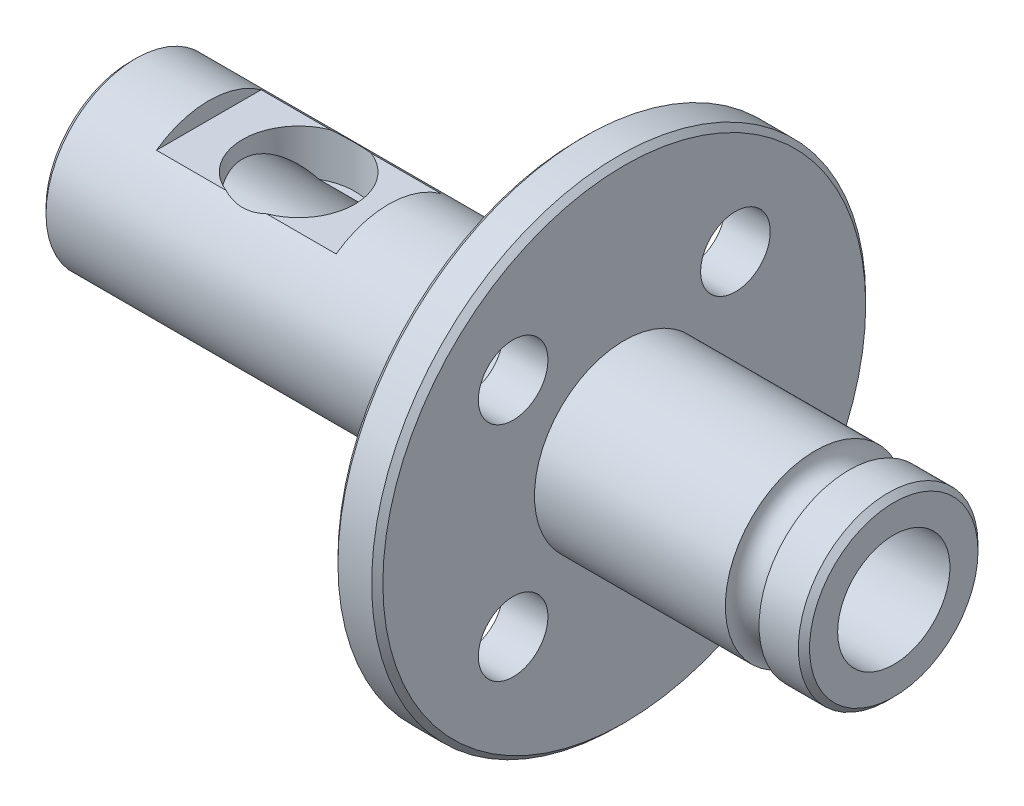
ISO-10303-21;
HEADER;
FILE_DESCRIPTION(('STEP AP214'),'2;1');
FILE_NAME('part.step','',(''),(''),'','','');
FILE_SCHEMA(('AUTOMOTIVE_DESIGN { 1 0 10303 214 1 1 1 1 }'));
ENDSEC;
DATA;
#1=APPLICATION_CONTEXT('core data for automotive mechanical design processes');
#2=APPLICATION_PROTOCOL_DEFINITION('international standard','automotive_design',2000,#1);
#3=PRODUCT_CONTEXT('',#1,'mechanical');
#4=PRODUCT('Part','Part','',(#3));
#5=PRODUCT_RELATED_PRODUCT_CATEGORY('part','',(#4));
#6=PRODUCT_DEFINITION_FORMATION('','',#4);
#7=PRODUCT_DEFINITION_CONTEXT('part definition',#1,'design');
#8=PRODUCT_DEFINITION('design','',#6,#7);
#9=PRODUCT_DEFINITION_SHAPE('','',#8);
#10=(LENGTH_UNIT() NAMED_UNIT(*) SI_UNIT(.MILLI.,.METRE.));
#11=(NAMED_UNIT(*) PLANE_ANGLE_UNIT() SI_UNIT($,.RADIAN.));
#12=(NAMED_UNIT(*) SI_UNIT($,.STERADIAN.) SOLID_ANGLE_UNIT());
#13=UNCERTAINTY_MEASURE_WITH_UNIT(LENGTH_MEASURE(1.E-05),#10,'distance_accuracy_value','');
#14=(GEOMETRIC_REPRESENTATION_CONTEXT(3) GLOBAL_UNCERTAINTY_ASSIGNED_CONTEXT((#13)) GLOBAL_UNIT_ASSIGNED_CONTEXT((#10,
#11,#12)) REPRESENTATION_CONTEXT('',''));
#15=CARTESIAN_POINT('',(0.,0.,0.));
#16=DIRECTION('',(0.,0.,1.));
#17=DIRECTION('',(1.,0.,0.));
#18=AXIS2_PLACEMENT_3D('',#15,#16,#17);
#19=CARTESIAN_POINT('',(34.,0.,0.));
#20=DIRECTION('',(-1.,0.,0.));
#21=DIRECTION('',(0.,0.,1.));
#22=AXIS2_PLACEMENT_3D('',#19,#20,#21);
#23=CYLINDRICAL_SURFACE('',#22,2.5);
#24=CARTESIAN_POINT('',(0.,0.,0.));
#25=DIRECTION('',(-1.,0.,0.));
#26=DIRECTION('',(0.,0.,1.));
#27=AXIS2_PLACEMENT_3D('',#24,#25,#26);
#28=CIRCLE('',#27,2.5);
#29=CARTESIAN_POINT('',(0.,0.,2.5));
#30=VERTEX_POINT('',#29);
#31=EDGE_CURVE('E175',#30,#30,#28,.T.);
#32=ORIENTED_EDGE('',*,*,#31,.T.);
#33=EDGE_LOOP('',(#32));
#34=FACE_BOUND('',#33,.T.);
#35=CARTESIAN_POINT('',(34.,0.,0.));
#36=DIRECTION('',(-1.,0.,0.));
#37=DIRECTION('',(0.,0.,1.));
#38=AXIS2_PLACEMENT_3D('',#35,#36,#37);
#39=CIRCLE('',#38,2.5);
#40=CARTESIAN_POINT('',(34.,0.,2.5));
#41=VERTEX_POINT('',#40);
#42=EDGE_CURVE('E176',#41,#41,#39,.T.);
#43=ORIENTED_EDGE('',*,*,#42,.F.);
#44=EDGE_LOOP('',(#43));
#45=FACE_BOUND('',#44,.T.);
#46=DIRECTION('',(-1.,0.,0.));
#47=VECTOR('',#46,1.);
#48=CARTESIAN_POINT('',(34.,1.25,-2.1650635094611));
#49=LINE('',#48,#47);
#50=CARTESIAN_POINT('',(6.25,1.25,-2.1650635094611));
#51=VERTEX_POINT('',#50);
#52=CARTESIAN_POINT('',(8.75,1.25,-2.1650635094611));
#53=VERTEX_POINT('',#52);
#54=EDGE_CURVE('E88',#51,#53,#49,.F.);
#55=ORIENTED_EDGE('',*,*,#54,.F.);
#56=CARTESIAN_POINT('',(7.5,0.,0.));
#57=DIRECTION('',(-0.707106781186547,-0.707106781186547,0.));
#58=DIRECTION('',(-0.707106781186547,0.707106781186547,0.));
#59=AXIS2_PLACEMENT_3D('',#56,#57,#58);
#60=ELLIPSE('',#59,3.53553390593274,2.5);
#61=CARTESIAN_POINT('',(6.25,1.25,2.1650635094611));
#62=VERTEX_POINT('',#61);
#63=EDGE_CURVE('E102',#51,#62,#60,.F.);
#64=ORIENTED_EDGE('',*,*,#63,.T.);
#65=DIRECTION('',(-1.,0.,0.));
#66=VECTOR('',#65,1.);
#67=CARTESIAN_POINT('',(34.,1.25,2.1650635094611));
#68=LINE('',#67,#66);
#69=CARTESIAN_POINT('',(8.75,1.25,2.1650635094611));
#70=VERTEX_POINT('',#69);
#71=EDGE_CURVE('E96',#70,#62,#68,.T.);
#72=ORIENTED_EDGE('',*,*,#71,.F.);
#73=CARTESIAN_POINT('',(7.5,0.,0.));
#74=DIRECTION('',(-0.707106781186547,0.707106781186547,0.));
#75=DIRECTION('',(-0.707106781186547,-0.707106781186547,0.));
#76=AXIS2_PLACEMENT_3D('',#73,#74,#75);
#77=ELLIPSE('',#76,3.53553390593274,2.5);
#78=EDGE_CURVE('E100',#70,#53,#77,.T.);
#79=ORIENTED_EDGE('',*,*,#78,.T.);
#80=EDGE_LOOP('',(#55,#64,#72,#79));
#81=FACE_BOUND('',#80,.T.);
#82=ADVANCED_FACE('F34',(#34,#45,#81),#23,.F.);
#83=CARTESIAN_POINT('',(0.,3.25,0.));
#84=DIRECTION('',(0.,-1.,0.));
#85=DIRECTION('',(0.,0.,-1.));
#86=AXIS2_PLACEMENT_3D('',#83,#84,#85);
#87=PLANE('',#86);
#88=DIRECTION('',(1.,0.,0.));
#89=VECTOR('',#88,1.);
#90=CARTESIAN_POINT('',(34.,3.25,-2.3318447632722));
#91=LINE('',#90,#89);
#92=CARTESIAN_POINT('',(11.5,3.25,-2.3318447632722));
#93=VERTEX_POINT('',#92);
#94=CARTESIAN_POINT('',(8.401387818866,3.25,-2.3318447632722));
#95=VERTEX_POINT('',#94);
#96=EDGE_CURVE('E230',#93,#95,#91,.F.);
#97=ORIENTED_EDGE('',*,*,#96,.T.);
#98=CARTESIAN_POINT('',(7.5,3.25,0.));
#99=DIRECTION('',(0.,1.,0.));
#100=DIRECTION('',(0.,0.,1.));
#101=AXIS2_PLACEMENT_3D('',#98,#99,#100);
#102=CIRCLE('',#101,2.5);
#103=CARTESIAN_POINT('',(8.401387818866,3.25,2.3318447632722));
#104=VERTEX_POINT('',#103);
#105=EDGE_CURVE('E461',#104,#95,#102,.T.);
#106=ORIENTED_EDGE('',*,*,#105,.F.);
#107=DIRECTION('',(1.,0.,0.));
#108=VECTOR('',#107,1.);
#109=CARTESIAN_POINT('',(34.,3.25,2.3318447632722));
#110=LINE('',#109,#108);
#111=CARTESIAN_POINT('',(11.5,3.25,2.3318447632722));
#112=VERTEX_POINT('',#111);
#113=EDGE_CURVE('E225',#104,#112,#110,.T.);
#114=ORIENTED_EDGE('',*,*,#113,.T.);
#115=DIRECTION('',(0.,0.,-1.));
#116=VECTOR('',#115,1.);
#117=CARTESIAN_POINT('',(11.5,3.25,2.5));
#118=LINE('',#117,#116);
#119=EDGE_CURVE('E182',#112,#93,#118,.T.);
#120=ORIENTED_EDGE('',*,*,#119,.T.);
#121=EDGE_LOOP('',(#97,#106,#114,#120));
#122=FACE_BOUND('',#121,.T.);
#123=ADVANCED_FACE('F137',(#122),#87,.F.);
#124=CARTESIAN_POINT('',(34.,4.,0.));
#125=DIRECTION('',(1.,0.,0.));
#126=DIRECTION('',(0.,0.,-1.));
#127=AXIS2_PLACEMENT_3D('',#124,#125,#126);
#128=PLANE('',#127);
#129=CARTESIAN_POINT('',(34.,0.,0.));
#130=DIRECTION('',(1.,0.,0.));
#131=DIRECTION('',(0.,0.,-1.));
#132=AXIS2_PLACEMENT_3D('',#129,#130,#131);
#133=CIRCLE('',#132,3.75000000000001);
#134=CARTESIAN_POINT('',(34.,0.,-3.75000000000001));
#135=VERTEX_POINT('',#134);
#136=EDGE_CURVE('E95',#135,#135,#133,.T.);
#137=ORIENTED_EDGE('',*,*,#136,.T.);
#138=EDGE_LOOP('',(#137));
#139=FACE_BOUND('',#138,.T.);
#140=ORIENTED_EDGE('',*,*,#42,.T.);
#141=EDGE_LOOP('',(#140));
#142=FACE_BOUND('',#141,.T.);
#143=ADVANCED_FACE('F284',(#139,#142),#128,.T.);
#144=CARTESIAN_POINT('',(34.,0.,0.));
#145=DIRECTION('',(1.,0.,0.));
#146=DIRECTION('',(0.,0.,-1.));
#147=AXIS2_PLACEMENT_3D('',#144,#145,#146);
#148=CYLINDRICAL_SURFACE('',#147,4.);
#149=CARTESIAN_POINT('',(33.75,0.,0.));
#150=DIRECTION('',(1.,0.,0.));
#151=DIRECTION('',(0.,0.,-1.));
#152=AXIS2_PLACEMENT_3D('',#149,#150,#151);
#153=CIRCLE('',#152,4.);
#154=CARTESIAN_POINT('',(33.75,0.,-4.));
#155=VERTEX_POINT('',#154);
#156=EDGE_CURVE('E238',#155,#155,#153,.F.);
#157=ORIENTED_EDGE('',*,*,#156,.T.);
#158=EDGE_LOOP('',(#157));
#159=FACE_BOUND('',#158,.T.);
#160=CARTESIAN_POINT('',(32.,0.,0.));
#161=DIRECTION('',(1.,0.,0.));
#162=DIRECTION('',(0.,0.,-1.));
#163=AXIS2_PLACEMENT_3D('',#160,#161,#162);
#164=CIRCLE('',#163,4.);
#165=CARTESIAN_POINT('',(32.,0.,-4.));
#166=VERTEX_POINT('',#165);
#167=EDGE_CURVE('E217',#166,#166,#164,.T.);
#168=ORIENTED_EDGE('',*,*,#167,.T.);
#169=EDGE_LOOP('',(#168));
#170=FACE_BOUND('',#169,.T.);
#171=ADVANCED_FACE('F287',(#159,#170),#148,.T.);
#172=CARTESIAN_POINT('',(31.25,0.,0.));
#173=DIRECTION('',(1.,0.,0.));
#174=DIRECTION('',(0.,0.,-1.));
#175=AXIS2_PLACEMENT_3D('',#172,#173,#174);
#176=TOROIDAL_SURFACE('',#175,4.,0.749999999999992);
#177=CARTESIAN_POINT('',(30.5,0.,0.));
#178=DIRECTION('',(1.,0.,0.));
#179=DIRECTION('',(0.,0.,-1.));
#180=AXIS2_PLACEMENT_3D('',#177,#178,#179);
#181=CIRCLE('',#180,4.);
#182=CARTESIAN_POINT('',(30.5,0.,-4.));
#183=VERTEX_POINT('',#182);
#184=EDGE_CURVE('E214',#183,#183,#181,.T.);
#185=ORIENTED_EDGE('',*,*,#184,.T.);
#186=EDGE_LOOP('',(#185));
#187=FACE_BOUND('',#186,.T.);
#188=ORIENTED_EDGE('',*,*,#167,.F.);
#189=EDGE_LOOP('',(#188));
#190=FACE_BOUND('',#189,.T.);
#191=ADVANCED_FACE('F291',(#187,#190),#176,.F.);
#192=CARTESIAN_POINT('',(34.,0.,0.));
#193=DIRECTION('',(1.,0.,0.));
#194=DIRECTION('',(0.,0.,-1.));
#195=AXIS2_PLACEMENT_3D('',#192,#193,#194);
#196=CYLINDRICAL_SURFACE('',#195,4.);
#197=CARTESIAN_POINT('',(22.,0.,0.));
#198=DIRECTION('',(1.,0.,0.));
#199=DIRECTION('',(0.,0.,-1.));
#200=AXIS2_PLACEMENT_3D('',#197,#198,#199);
#201=CIRCLE('',#200,4.);
#202=CARTESIAN_POINT('',(22.,0.,-4.));
#203=VERTEX_POINT('',#202);
#204=EDGE_CURVE('E211',#203,#203,#201,.T.);
#205=ORIENTED_EDGE('',*,*,#204,.T.);
#206=EDGE_LOOP('',(#205));
#207=FACE_BOUND('',#206,.T.);
#208=ORIENTED_EDGE('',*,*,#184,.F.);
#209=EDGE_LOOP('',(#208));
#210=FACE_BOUND('',#209,.T.);
#211=ADVANCED_FACE('F295',(#207,#210),#196,.T.);
#212=CARTESIAN_POINT('',(22.,11.,0.));
#213=DIRECTION('',(1.,0.,0.));
#214=DIRECTION('',(0.,0.,-1.));
#215=AXIS2_PLACEMENT_3D('',#212,#213,#214);
#216=PLANE('',#215);
#217=CARTESIAN_POINT('',(22.,0.,0.));
#218=DIRECTION('',(1.,0.,0.));
#219=DIRECTION('',(0.,0.,-1.));
#220=AXIS2_PLACEMENT_3D('',#217,#218,#219);
#221=CIRCLE('',#220,10.75);
#222=CARTESIAN_POINT('',(22.,0.,-10.75));
#223=VERTEX_POINT('',#222);
#224=EDGE_CURVE('E241',#223,#223,#221,.T.);
#225=ORIENTED_EDGE('',*,*,#224,.T.);
#226=EDGE_LOOP('',(#225));
#227=FACE_BOUND('',#226,.T.);
#228=CARTESIAN_POINT('',(22.,4.94974746830584,-4.94974746830582));
#229=DIRECTION('',(1.,0.,0.));
#230=DIRECTION('',(0.,0.,-1.));
#231=AXIS2_PLACEMENT_3D('',#228,#229,#230);
#232=CIRCLE('',#231,1.55);
#233=CARTESIAN_POINT('',(22.,4.94974746830584,-6.49974746830582));
#234=VERTEX_POINT('',#233);
#235=EDGE_CURVE('E205',#234,#234,#232,.T.);
#236=ORIENTED_EDGE('',*,*,#235,.F.);
#237=EDGE_LOOP('',(#236));
#238=FACE_BOUND('',#237,.T.);
#239=CARTESIAN_POINT('',(22.,-4.94974746830584,4.94974746830582));
#240=DIRECTION('',(1.,0.,0.));
#241=DIRECTION('',(0.,0.,-1.));
#242=AXIS2_PLACEMENT_3D('',#239,#240,#241);
#243=CIRCLE('',#242,1.55);
#244=CARTESIAN_POINT('',(22.,-4.94974746830584,3.39974746830582));
#245=VERTEX_POINT('',#244);
#246=EDGE_CURVE('E202',#245,#245,#243,.T.);
#247=ORIENTED_EDGE('',*,*,#246,.F.);
#248=EDGE_LOOP('',(#247));
#249=FACE_BOUND('',#248,.T.);
#250=CARTESIAN_POINT('',(22.,-4.94974746830584,-4.94974746830582));
#251=DIRECTION('',(1.,0.,0.));
#252=DIRECTION('',(0.,0.,-1.));
#253=AXIS2_PLACEMENT_3D('',#250,#251,#252);
#254=CIRCLE('',#253,1.55);
#255=CARTESIAN_POINT('',(22.,-4.94974746830584,-6.49974746830582));
#256=VERTEX_POINT('',#255);
#257=EDGE_CURVE('E199',#256,#256,#254,.T.);
#258=ORIENTED_EDGE('',*,*,#257,.F.);
#259=EDGE_LOOP('',(#258));
#260=FACE_BOUND('',#259,.T.);
#261=CARTESIAN_POINT('',(22.,4.94974746830584,4.94974746830582));
#262=DIRECTION('',(1.,0.,0.));
#263=DIRECTION('',(0.,0.,-1.));
#264=AXIS2_PLACEMENT_3D('',#261,#262,#263);
#265=CIRCLE('',#264,1.55);
#266=CARTESIAN_POINT('',(22.,4.94974746830584,3.39974746830582));
#267=VERTEX_POINT('',#266);
#268=EDGE_CURVE('E196',#267,#267,#265,.T.);
#269=ORIENTED_EDGE('',*,*,#268,.F.);
#270=EDGE_LOOP('',(#269));
#271=FACE_BOUND('',#270,.T.);
#272=ORIENTED_EDGE('',*,*,#204,.F.);
#273=EDGE_LOOP('',(#272));
#274=FACE_BOUND('',#273,.T.);
#275=ADVANCED_FACE('F299',(#227,#238,#249,#260,#271,#274),#216,.T.);
#276=CARTESIAN_POINT('',(34.,0.,0.));
#277=DIRECTION('',(1.,0.,0.));
#278=DIRECTION('',(0.,0.,-1.));
#279=AXIS2_PLACEMENT_3D('',#276,#277,#278);
#280=CYLINDRICAL_SURFACE('',#279,11.);
#281=CARTESIAN_POINT('',(21.75,0.,0.));
#282=DIRECTION('',(1.,0.,0.));
#283=DIRECTION('',(0.,0.,-1.));
#284=AXIS2_PLACEMENT_3D('',#281,#282,#283);
#285=CIRCLE('',#284,11.);
#286=CARTESIAN_POINT('',(21.75,0.,-11.));
#287=VERTEX_POINT('',#286);
#288=EDGE_CURVE('E247',#287,#287,#285,.F.);
#289=ORIENTED_EDGE('',*,*,#288,.T.);
#290=EDGE_LOOP('',(#289));
#291=FACE_BOUND('',#290,.T.);
#292=CARTESIAN_POINT('',(20.25,0.,0.));
#293=DIRECTION('',(-1.,0.,0.));
#294=DIRECTION('',(0.,0.,1.));
#295=AXIS2_PLACEMENT_3D('',#292,#293,#294);
#296=CIRCLE('',#295,11.);
#297=CARTESIAN_POINT('',(20.25,0.,11.));
#298=VERTEX_POINT('',#297);
#299=EDGE_CURVE('E244',#298,#298,#296,.F.);
#300=ORIENTED_EDGE('',*,*,#299,.T.);
#301=EDGE_LOOP('',(#300));
#302=FACE_BOUND('',#301,.T.);
#303=ADVANCED_FACE('F303',(#291,#302),#280,.T.);
#304=CARTESIAN_POINT('',(20.,4.,0.));
#305=DIRECTION('',(-1.,0.,0.));
#306=DIRECTION('',(0.,0.,1.));
#307=AXIS2_PLACEMENT_3D('',#304,#305,#306);
#308=PLANE('',#307);
#309=CARTESIAN_POINT('',(20.,0.,0.));
#310=DIRECTION('',(-1.,0.,0.));
#311=DIRECTION('',(0.,0.,1.));
#312=AXIS2_PLACEMENT_3D('',#309,#310,#311);
#313=CIRCLE('',#312,10.75);
#314=CARTESIAN_POINT('',(20.,0.,10.75));
#315=VERTEX_POINT('',#314);
#316=EDGE_CURVE('E250',#315,#315,#313,.T.);
#317=ORIENTED_EDGE('',*,*,#316,.T.);
#318=EDGE_LOOP('',(#317));
#319=FACE_BOUND('',#318,.T.);
#320=CARTESIAN_POINT('',(20.,4.94974746830584,-4.94974746830582));
#321=DIRECTION('',(-1.,0.,0.));
#322=DIRECTION('',(0.,0.,-1.));
#323=AXIS2_PLACEMENT_3D('',#320,#321,#322);
#324=CIRCLE('',#323,1.55);
#325=CARTESIAN_POINT('',(20.,4.94974746830584,-6.49974746830582));
#326=VERTEX_POINT('',#325);
#327=EDGE_CURVE('E188',#326,#326,#324,.T.);
#328=ORIENTED_EDGE('',*,*,#327,.F.);
#329=EDGE_LOOP('',(#328));
#330=FACE_BOUND('',#329,.T.);
#331=CARTESIAN_POINT('',(20.,-4.94974746830584,4.94974746830582));
#332=DIRECTION('',(-1.,0.,0.));
#333=DIRECTION('',(0.,0.,-1.));
#334=AXIS2_PLACEMENT_3D('',#331,#332,#333);
#335=CIRCLE('',#334,1.55);
#336=CARTESIAN_POINT('',(20.,-4.94974746830584,3.39974746830582));
#337=VERTEX_POINT('',#336);
#338=EDGE_CURVE('E187',#337,#337,#335,.T.);
#339=ORIENTED_EDGE('',*,*,#338,.F.);
#340=EDGE_LOOP('',(#339));
#341=FACE_BOUND('',#340,.T.);
#342=CARTESIAN_POINT('',(20.,-4.94974746830584,-4.94974746830582));
#343=DIRECTION('',(-1.,0.,0.));
#344=DIRECTION('',(0.,0.,1.));
#345=AXIS2_PLACEMENT_3D('',#342,#343,#344);
#346=CIRCLE('',#345,1.55);
#347=CARTESIAN_POINT('',(20.,-4.94974746830584,-3.39974746830582));
#348=VERTEX_POINT('',#347);
#349=EDGE_CURVE('E180',#348,#348,#346,.T.);
#350=ORIENTED_EDGE('',*,*,#349,.F.);
#351=EDGE_LOOP('',(#350));
#352=FACE_BOUND('',#351,.T.);
#353=CARTESIAN_POINT('',(20.,4.94974746830584,4.94974746830582));
#354=DIRECTION('',(-1.,0.,0.));
#355=DIRECTION('',(0.,0.,1.));
#356=AXIS2_PLACEMENT_3D('',#353,#354,#355);
#357=CIRCLE('',#356,1.55);
#358=CARTESIAN_POINT('',(20.,4.94974746830584,6.49974746830582));
#359=VERTEX_POINT('',#358);
#360=EDGE_CURVE('E191',#359,#359,#357,.T.);
#361=ORIENTED_EDGE('',*,*,#360,.F.);
#362=EDGE_LOOP('',(#361));
#363=FACE_BOUND('',#362,.T.);
#364=CARTESIAN_POINT('',(20.,0.,0.));
#365=DIRECTION('',(1.,0.,0.));
#366=DIRECTION('',(0.,0.,-1.));
#367=AXIS2_PLACEMENT_3D('',#364,#365,#366);
#368=CIRCLE('',#367,4.);
#369=CARTESIAN_POINT('',(20.,0.,-4.));
#370=VERTEX_POINT('',#369);
#371=EDGE_CURVE('E208',#370,#370,#368,.T.);
#372=ORIENTED_EDGE('',*,*,#371,.T.);
#373=EDGE_LOOP('',(#372));
#374=FACE_BOUND('',#373,.T.);
#375=ADVANCED_FACE('F169',(#319,#330,#341,#352,#363,#374),#308,.T.);
#376=CARTESIAN_POINT('',(34.,0.,0.));
#377=DIRECTION('',(1.,0.,0.));
#378=DIRECTION('',(0.,0.,-1.));
#379=AXIS2_PLACEMENT_3D('',#376,#377,#378);
#380=CYLINDRICAL_SURFACE('',#379,4.);
#381=CARTESIAN_POINT('',(0.249999999999993,0.,0.));
#382=DIRECTION('',(-1.,0.,0.));
#383=DIRECTION('',(0.,0.,1.));
#384=AXIS2_PLACEMENT_3D('',#381,#382,#383);
#385=CIRCLE('',#384,4.);
#386=CARTESIAN_POINT('',(0.249999999999993,0.,4.));
#387=VERTEX_POINT('',#386);
#388=EDGE_CURVE('E43',#387,#387,#385,.F.);
#389=ORIENTED_EDGE('',*,*,#388,.T.);
#390=EDGE_LOOP('',(#389));
#391=FACE_BOUND('',#390,.T.);
#392=CARTESIAN_POINT('',(6.598612181134,3.25,2.3318447632722));
#393=CARTESIAN_POINT('',(6.65107229883034,3.23545094828911,2.35212058302273));
#394=CARTESIAN_POINT('',(6.70442824310382,3.22182658645101,2.37071160075321));
#395=CARTESIAN_POINT('',(6.81279401949057,3.19678929465881,2.40436642988356));
#396=CARTESIAN_POINT('',(6.86780517068707,3.18537818548835,2.41942733926326));
#397=CARTESIAN_POINT('',(7.03465545068169,3.15510210712078,2.45895458338862));
#398=CARTESIAN_POINT('',(7.14862216037378,3.14010445222921,2.47788667647815));
#399=CARTESIAN_POINT('',(7.37964643909848,3.12268488518486,2.49981057204269));
#400=CARTESIAN_POINT('',(7.49671724063431,3.12033039992166,2.50271691027379));
#401=CARTESIAN_POINT('',(7.72960787339433,3.12876737924364,2.4921581585379));
#402=CARTESIAN_POINT('',(7.84542819747562,3.13955345849471,2.47869977525005));
#403=CARTESIAN_POINT('',(8.03523554008613,3.16713112663541,2.44327392358348));
#404=CARTESIAN_POINT('',(8.1105289800985,3.18080999468614,2.42552215130219));
#405=CARTESIAN_POINT('',(8.25823760046943,3.21243034120725,2.38347754259046));
#406=CARTESIAN_POINT('',(8.33065660239289,3.23036592256852,2.35919374925204));
#407=CARTESIAN_POINT('',(8.401387818866,3.25,2.3318447632722));
#408=B_SPLINE_CURVE_WITH_KNOTS('',3,(#392,#393,#394,#395,#396,#397,#398,#399,#400,#401,#402,
#403,#404,#405,#406,#407),.UNSPECIFIED.,.F.,.F.,(4,2,2,2,2,2,2,4),(0.,0.174209857347443,
0.348562430177186,0.696242801318246,1.04577554754894,1.39516509463678,1.6304226898858,
1.86535625021086),.UNSPECIFIED.);
#409=CARTESIAN_POINT('',(6.598612181134,3.25,2.3318447632722));
#410=VERTEX_POINT('',#409);
#411=EDGE_CURVE('E105',#410,#104,#408,.T.);
#412=ORIENTED_EDGE('',*,*,#411,.F.);
#413=CARTESIAN_POINT('',(3.5,3.25,2.3318447632722));
#414=VERTEX_POINT('',#413);
#415=EDGE_CURVE('E226',#414,#410,#110,.T.);
#416=ORIENTED_EDGE('',*,*,#415,.F.);
#417=CARTESIAN_POINT('',(3.5,0.,0.));
#418=DIRECTION('',(-1.,0.,0.));
#419=DIRECTION('',(0.,0.,1.));
#420=AXIS2_PLACEMENT_3D('',#417,#418,#419);
#421=CIRCLE('',#420,4.);
#422=CARTESIAN_POINT('',(3.5,3.25,-2.3318447632722));
#423=VERTEX_POINT('',#422);
#424=EDGE_CURVE('E220',#423,#414,#421,.F.);
#425=ORIENTED_EDGE('',*,*,#424,.F.);
#426=CARTESIAN_POINT('',(6.598612181134,3.25,-2.3318447632722));
#427=VERTEX_POINT('',#426);
#428=EDGE_CURVE('E229',#427,#423,#91,.F.);
#429=ORIENTED_EDGE('',*,*,#428,.F.);
#430=CARTESIAN_POINT('',(8.401387818866,3.25,-2.3318447632722));
#431=CARTESIAN_POINT('',(8.34892770116966,3.23545094828911,-2.35212058302273));
#432=CARTESIAN_POINT('',(8.29557175689618,3.22182658645101,-2.37071160075321));
#433=CARTESIAN_POINT('',(8.18720598050943,3.19678929465881,-2.40436642988356));
#434=CARTESIAN_POINT('',(8.13219482931292,3.18537818548835,-2.41942733926326));
#435=CARTESIAN_POINT('',(7.96534454931831,3.15510210712078,-2.45895458338862));
#436=CARTESIAN_POINT('',(7.85137783962622,3.14010445222921,-2.47788667647815));
#437=CARTESIAN_POINT('',(7.62035356090152,3.12268488518486,-2.49981057204269));
#438=CARTESIAN_POINT('',(7.50328275936569,3.12033039992166,-2.50271691027379));
#439=CARTESIAN_POINT('',(7.27039212660567,3.12876737924364,-2.4921581585379));
#440=CARTESIAN_POINT('',(7.15457180252438,3.13955345849471,-2.47869977525005));
#441=CARTESIAN_POINT('',(6.96476445991388,3.16713112663541,-2.44327392358348));
#442=CARTESIAN_POINT('',(6.8894710199015,3.18080999468614,-2.42552215130219));
#443=CARTESIAN_POINT('',(6.74176239953057,3.21243034120725,-2.38347754259046));
#444=CARTESIAN_POINT('',(6.66934339760711,3.23036592256852,-2.35919374925204));
#445=CARTESIAN_POINT('',(6.598612181134,3.25,-2.3318447632722));
#446=B_SPLINE_CURVE_WITH_KNOTS('',3,(#430,#431,#432,#433,#434,#435,#436,#437,#438,#439,#440,
#441,#442,#443,#444,#445),.UNSPECIFIED.,.F.,.F.,(4,2,2,2,2,2,2,4),(0.,0.174209857347444,
0.348562430177186,0.696242801318246,1.04577554754894,1.39516509463678,1.6304226898858,
1.86535625021086),.UNSPECIFIED.);
#447=EDGE_CURVE('E57',#95,#427,#446,.T.);
#448=ORIENTED_EDGE('',*,*,#447,.F.);
#449=ORIENTED_EDGE('',*,*,#96,.F.);
#450=CARTESIAN_POINT('',(11.5,0.,0.));
#451=DIRECTION('',(1.,0.,0.));
#452=DIRECTION('',(0.,0.,-1.));
#453=AXIS2_PLACEMENT_3D('',#450,#451,#452);
#454=CIRCLE('',#453,4.);
#455=EDGE_CURVE('E223',#112,#93,#454,.F.);
#456=ORIENTED_EDGE('',*,*,#455,.F.);
#457=ORIENTED_EDGE('',*,*,#113,.F.);
#458=EDGE_LOOP('',(#412,#416,#425,#429,#448,#449,#456,#457));
#459=FACE_BOUND('',#458,.T.);
#460=ORIENTED_EDGE('',*,*,#371,.F.);
#461=EDGE_LOOP('',(#460));
#462=FACE_BOUND('',#461,.T.);
#463=ADVANCED_FACE('F121',(#391,#459,#462),#380,.T.);
#464=CARTESIAN_POINT('',(0.,0.,0.));
#465=DIRECTION('',(-1.,0.,0.));
#466=DIRECTION('',(0.,0.,1.));
#467=AXIS2_PLACEMENT_3D('',#464,#465,#466);
#468=PLANE('',#467);
#469=CARTESIAN_POINT('',(0.,0.,0.));
#470=DIRECTION('',(-1.,0.,0.));
#471=DIRECTION('',(0.,0.,1.));
#472=AXIS2_PLACEMENT_3D('',#469,#470,#471);
#473=CIRCLE('',#472,3.75);
#474=CARTESIAN_POINT('',(0.,0.,3.75));
#475=VERTEX_POINT('',#474);
#476=EDGE_CURVE('E11',#475,#475,#473,.T.);
#477=ORIENTED_EDGE('',*,*,#476,.T.);
#478=EDGE_LOOP('',(#477));
#479=FACE_BOUND('',#478,.T.);
#480=ORIENTED_EDGE('',*,*,#31,.F.);
#481=EDGE_LOOP('',(#480));
#482=FACE_BOUND('',#481,.T.);
#483=ADVANCED_FACE('F162',(#479,#482),#468,.T.);
#484=CARTESIAN_POINT('',(34.,4.94974746830584,4.94974746830582));
#485=DIRECTION('',(-1.,0.,0.));
#486=DIRECTION('',(0.,0.,1.));
#487=AXIS2_PLACEMENT_3D('',#484,#485,#486);
#488=CYLINDRICAL_SURFACE('',#487,1.55);
#489=ORIENTED_EDGE('',*,*,#268,.T.);
#490=EDGE_LOOP('',(#489));
#491=FACE_BOUND('',#490,.T.);
#492=ORIENTED_EDGE('',*,*,#360,.T.);
#493=EDGE_LOOP('',(#492));
#494=FACE_BOUND('',#493,.T.);
#495=ADVANCED_FACE('F153',(#491,#494),#488,.F.);
#496=CARTESIAN_POINT('',(34.,-4.94974746830584,-4.94974746830582));
#497=DIRECTION('',(-1.,0.,0.));
#498=DIRECTION('',(0.,0.,1.));
#499=AXIS2_PLACEMENT_3D('',#496,#497,#498);
#500=CYLINDRICAL_SURFACE('',#499,1.55);
#501=ORIENTED_EDGE('',*,*,#257,.T.);
#502=EDGE_LOOP('',(#501));
#503=FACE_BOUND('',#502,.T.);
#504=ORIENTED_EDGE('',*,*,#349,.T.);
#505=EDGE_LOOP('',(#504));
#506=FACE_BOUND('',#505,.T.);
#507=ADVANCED_FACE('F149',(#503,#506),#500,.F.);
#508=CARTESIAN_POINT('',(34.,-4.94974746830584,4.94974746830582));
#509=DIRECTION('',(-1.,0.,0.));
#510=DIRECTION('',(0.,0.,1.));
#511=AXIS2_PLACEMENT_3D('',#508,#509,#510);
#512=CYLINDRICAL_SURFACE('',#511,1.55);
#513=ORIENTED_EDGE('',*,*,#246,.T.);
#514=EDGE_LOOP('',(#513));
#515=FACE_BOUND('',#514,.T.);
#516=ORIENTED_EDGE('',*,*,#338,.T.);
#517=EDGE_LOOP('',(#516));
#518=FACE_BOUND('',#517,.T.);
#519=ADVANCED_FACE('F152',(#515,#518),#512,.F.);
#520=CARTESIAN_POINT('',(34.,4.94974746830584,-4.94974746830582));
#521=DIRECTION('',(-1.,0.,0.));
#522=DIRECTION('',(0.,0.,1.));
#523=AXIS2_PLACEMENT_3D('',#520,#521,#522);
#524=CYLINDRICAL_SURFACE('',#523,1.55);
#525=ORIENTED_EDGE('',*,*,#235,.T.);
#526=EDGE_LOOP('',(#525));
#527=FACE_BOUND('',#526,.T.);
#528=ORIENTED_EDGE('',*,*,#327,.T.);
#529=EDGE_LOOP('',(#528));
#530=FACE_BOUND('',#529,.T.);
#531=ADVANCED_FACE('F144',(#527,#530),#524,.F.);
#532=CARTESIAN_POINT('',(11.5,3.25,2.5));
#533=DIRECTION('',(1.,0.,0.));
#534=DIRECTION('',(0.,0.,-1.));
#535=AXIS2_PLACEMENT_3D('',#532,#533,#534);
#536=PLANE('',#535);
#537=ORIENTED_EDGE('',*,*,#119,.F.);
#538=ORIENTED_EDGE('',*,*,#455,.T.);
#539=EDGE_LOOP('',(#537,#538));
#540=FACE_BOUND('',#539,.T.);
#541=ADVANCED_FACE('F140',(#540),#536,.F.);
#542=CARTESIAN_POINT('',(3.5,3.25,2.5));
#543=DIRECTION('',(-1.,0.,0.));
#544=DIRECTION('',(0.,0.,1.));
#545=AXIS2_PLACEMENT_3D('',#542,#543,#544);
#546=PLANE('',#545);
#547=DIRECTION('',(0.,0.,1.));
#548=VECTOR('',#547,1.);
#549=CARTESIAN_POINT('',(3.5,3.25,2.5));
#550=LINE('',#549,#548);
#551=EDGE_CURVE('E177',#423,#414,#550,.T.);
#552=ORIENTED_EDGE('',*,*,#551,.F.);
#553=ORIENTED_EDGE('',*,*,#424,.T.);
#554=EDGE_LOOP('',(#552,#553));
#555=FACE_BOUND('',#554,.T.);
#556=ADVANCED_FACE('F135',(#555),#546,.F.);
#557=ORIENTED_EDGE('',*,*,#415,.T.);
#558=CARTESIAN_POINT('',(7.5,3.25,0.));
#559=DIRECTION('',(0.,-1.,0.));
#560=DIRECTION('',(0.,0.,-1.));
#561=AXIS2_PLACEMENT_3D('',#558,#559,#560);
#562=CIRCLE('',#561,2.5);
#563=EDGE_CURVE('E233',#410,#427,#562,.T.);
#564=ORIENTED_EDGE('',*,*,#563,.T.);
#565=ORIENTED_EDGE('',*,*,#428,.T.);
#566=ORIENTED_EDGE('',*,*,#551,.T.);
#567=EDGE_LOOP('',(#557,#564,#565,#566));
#568=FACE_BOUND('',#567,.T.);
#569=ADVANCED_FACE('F131',(#568),#87,.F.);
#570=CARTESIAN_POINT('',(7.5,1.25,0.));
#571=DIRECTION('',(0.,1.,0.));
#572=DIRECTION('',(0.,0.,1.));
#573=AXIS2_PLACEMENT_3D('',#570,#571,#572);
#574=PLANE('',#573);
#575=ORIENTED_EDGE('',*,*,#54,.T.);
#576=CARTESIAN_POINT('',(7.5,1.25,0.));
#577=DIRECTION('',(0.,1.,0.));
#578=DIRECTION('',(0.,0.,1.));
#579=AXIS2_PLACEMENT_3D('',#576,#577,#578);
#580=CIRCLE('',#579,2.5);
#581=EDGE_CURVE('E91',#53,#51,#580,.T.);
#582=ORIENTED_EDGE('',*,*,#581,.T.);
#583=EDGE_LOOP('',(#575,#582));
#584=FACE_BOUND('',#583,.T.);
#585=ADVANCED_FACE('F90',(#584),#574,.T.);
#586=ORIENTED_EDGE('',*,*,#71,.T.);
#587=EDGE_CURVE('E49',#62,#70,#580,.T.);
#588=ORIENTED_EDGE('',*,*,#587,.T.);
#589=EDGE_LOOP('',(#586,#588));
#590=FACE_BOUND('',#589,.T.);
#591=ADVANCED_FACE('F130',(#590),#574,.T.);
#592=CARTESIAN_POINT('',(7.5,1.25,0.));
#593=DIRECTION('',(0.,1.,0.));
#594=DIRECTION('',(0.,0.,1.));
#595=AXIS2_PLACEMENT_3D('',#592,#593,#594);
#596=CYLINDRICAL_SURFACE('',#595,2.5);
#597=ORIENTED_EDGE('',*,*,#411,.T.);
#598=ORIENTED_EDGE('',*,*,#105,.T.);
#599=ORIENTED_EDGE('',*,*,#447,.T.);
#600=ORIENTED_EDGE('',*,*,#563,.F.);
#601=EDGE_LOOP('',(#597,#598,#599,#600));
#602=FACE_BOUND('',#601,.T.);
#603=ORIENTED_EDGE('',*,*,#587,.F.);
#604=ORIENTED_EDGE('',*,*,#63,.F.);
#605=ORIENTED_EDGE('',*,*,#581,.F.);
#606=ORIENTED_EDGE('',*,*,#78,.F.);
#607=EDGE_LOOP('',(#603,#604,#605,#606));
#608=FACE_BOUND('',#607,.T.);
#609=ADVANCED_FACE('F99',(#602,#608),#596,.F.);
#610=CARTESIAN_POINT('',(34.,0.,0.));
#611=DIRECTION('',(-1.,0.,0.));
#612=DIRECTION('',(0.,0.,1.));
#613=AXIS2_PLACEMENT_3D('',#610,#611,#612);
#614=CONICAL_SURFACE('',#613,3.75000000000001,0.78539816339744);
#615=ORIENTED_EDGE('',*,*,#156,.F.);
#616=EDGE_LOOP('',(#615));
#617=FACE_BOUND('',#616,.T.);
#618=ORIENTED_EDGE('',*,*,#136,.F.);
#619=EDGE_LOOP('',(#618));
#620=FACE_BOUND('',#619,.T.);
#621=ADVANCED_FACE('F129',(#617,#620),#614,.T.);
#622=CARTESIAN_POINT('',(22.,0.,0.));
#623=DIRECTION('',(-1.,0.,0.));
#624=DIRECTION('',(0.,0.,1.));
#625=AXIS2_PLACEMENT_3D('',#622,#623,#624);
#626=CONICAL_SURFACE('',#625,10.75,0.785398163397441);
#627=ORIENTED_EDGE('',*,*,#288,.F.);
#628=EDGE_LOOP('',(#627));
#629=FACE_BOUND('',#628,.T.);
#630=ORIENTED_EDGE('',*,*,#224,.F.);
#631=EDGE_LOOP('',(#630));
#632=FACE_BOUND('',#631,.T.);
#633=ADVANCED_FACE('F262',(#629,#632),#626,.T.);
#634=CARTESIAN_POINT('',(20.25,0.,0.));
#635=DIRECTION('',(1.,0.,0.));
#636=DIRECTION('',(0.,0.,-1.));
#637=AXIS2_PLACEMENT_3D('',#634,#635,#636);
#638=CONICAL_SURFACE('',#637,11.,0.785398163397441);
#639=ORIENTED_EDGE('',*,*,#316,.F.);
#640=EDGE_LOOP('',(#639));
#641=FACE_BOUND('',#640,.T.);
#642=ORIENTED_EDGE('',*,*,#299,.F.);
#643=EDGE_LOOP('',(#642));
#644=FACE_BOUND('',#643,.T.);
#645=ADVANCED_FACE('F257',(#641,#644),#638,.T.);
#646=CARTESIAN_POINT('',(0.249999999999993,0.,0.));
#647=DIRECTION('',(1.,0.,0.));
#648=DIRECTION('',(0.,0.,-1.));
#649=AXIS2_PLACEMENT_3D('',#646,#647,#648);
#650=CONICAL_SURFACE('',#649,4.,0.785398163397455);
#651=ORIENTED_EDGE('',*,*,#476,.F.);
#652=EDGE_LOOP('',(#651));
#653=FACE_BOUND('',#652,.T.);
#654=ORIENTED_EDGE('',*,*,#388,.F.);
#655=EDGE_LOOP('',(#654));
#656=FACE_BOUND('',#655,.T.);
#657=ADVANCED_FACE('F37',(#653,#656),#650,.T.);
#658=CLOSED_SHELL('',(#82,#123,#143,#171,#191,#211,#275,#303,#375,#463,#483,#495,#507,#519,#531,
#541,#556,#569,#585,#591,#609,#621,#633,#645,#657));
#659=MANIFOLD_SOLID_BREP('B2',#658);
#660=ADVANCED_BREP_SHAPE_REPRESENTATION('',(#18,#659),#14);
#661=SHAPE_DEFINITION_REPRESENTATION(#9,#660);
ENDSEC;
END-ISO-10303-21;
